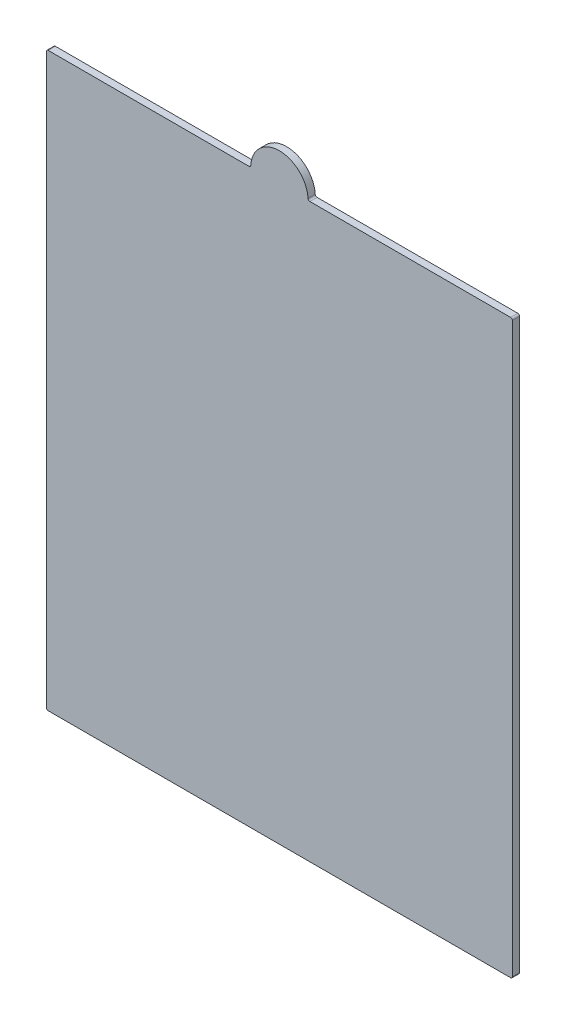
ISO-10303-21;
HEADER;
FILE_DESCRIPTION(('STEP AP214'),'2;1');
FILE_NAME('part.step','',(''),(''),'','','');
FILE_SCHEMA(('AUTOMOTIVE_DESIGN { 1 0 10303 214 1 1 1 1 }'));
ENDSEC;
DATA;
#1=APPLICATION_CONTEXT('core data for automotive mechanical design processes');
#2=APPLICATION_PROTOCOL_DEFINITION('international standard','automotive_design',2000,#1);
#3=PRODUCT_CONTEXT('',#1,'mechanical');
#4=PRODUCT('Part','Part','',(#3));
#5=PRODUCT_RELATED_PRODUCT_CATEGORY('part','',(#4));
#6=PRODUCT_DEFINITION_FORMATION('','',#4);
#7=PRODUCT_DEFINITION_CONTEXT('part definition',#1,'design');
#8=PRODUCT_DEFINITION('design','',#6,#7);
#9=PRODUCT_DEFINITION_SHAPE('','',#8);
#10=(LENGTH_UNIT() NAMED_UNIT(*) SI_UNIT(.MILLI.,.METRE.));
#11=(NAMED_UNIT(*) PLANE_ANGLE_UNIT() SI_UNIT($,.RADIAN.));
#12=(NAMED_UNIT(*) SI_UNIT($,.STERADIAN.) SOLID_ANGLE_UNIT());
#13=UNCERTAINTY_MEASURE_WITH_UNIT(LENGTH_MEASURE(1.E-05),#10,'distance_accuracy_value','');
#14=(GEOMETRIC_REPRESENTATION_CONTEXT(3) GLOBAL_UNCERTAINTY_ASSIGNED_CONTEXT((#13)) GLOBAL_UNIT_ASSIGNED_CONTEXT((#10,
#11,#12)) REPRESENTATION_CONTEXT('',''));
#15=CARTESIAN_POINT('',(0.,0.,0.));
#16=DIRECTION('',(0.,0.,1.));
#17=DIRECTION('',(1.,0.,0.));
#18=AXIS2_PLACEMENT_3D('',#15,#16,#17);
#19=CARTESIAN_POINT('',(0.,253.103,3.175));
#20=DIRECTION('',(0.,-1.,0.));
#21=DIRECTION('',(0.,0.,-1.));
#22=AXIS2_PLACEMENT_3D('',#19,#20,#21);
#23=PLANE('',#22);
#24=DIRECTION('',(-1.,0.,0.));
#25=VECTOR('',#24,1.);
#26=CARTESIAN_POINT('',(0.,253.103,0.));
#27=LINE('',#26,#25);
#28=CARTESIAN_POINT('',(89.6561158183963,253.103,0.));
#29=VERTEX_POINT('',#28);
#30=CARTESIAN_POINT('',(0.79375,253.103,0.));
#31=VERTEX_POINT('',#30);
#32=EDGE_CURVE('E156',#29,#31,#27,.T.);
#33=ORIENTED_EDGE('',*,*,#32,.T.);
#34=DIRECTION('',(0.,0.,-1.));
#35=VECTOR('',#34,1.);
#36=CARTESIAN_POINT('',(0.79375,253.103,3.175));
#37=LINE('',#36,#35);
#38=CARTESIAN_POINT('',(0.79375,253.103,3.175));
#39=VERTEX_POINT('',#38);
#40=EDGE_CURVE('E51',#31,#39,#37,.F.);
#41=ORIENTED_EDGE('',*,*,#40,.T.);
#42=DIRECTION('',(-1.,0.,0.));
#43=VECTOR('',#42,1.);
#44=CARTESIAN_POINT('',(0.,253.103,3.175));
#45=LINE('',#44,#43);
#46=CARTESIAN_POINT('',(89.6561158183963,253.103,3.175));
#47=VERTEX_POINT('',#46);
#48=EDGE_CURVE('E230',#47,#39,#45,.T.);
#49=ORIENTED_EDGE('',*,*,#48,.F.);
#50=DIRECTION('',(0.,0.,1.));
#51=VECTOR('',#50,1.);
#52=CARTESIAN_POINT('',(89.6561158183963,253.103,0.));
#53=LINE('',#52,#51);
#54=EDGE_CURVE('E193',#47,#29,#53,.F.);
#55=ORIENTED_EDGE('',*,*,#54,.T.);
#56=EDGE_LOOP('',(#33,#41,#49,#55));
#57=FACE_BOUND('',#56,.T.);
#58=ADVANCED_FACE('F36',(#57),#23,.F.);
#59=CARTESIAN_POINT('',(205.45925,253.103,3.175));
#60=VERTEX_POINT('',#59);
#61=CARTESIAN_POINT('',(116.596884181604,253.103,3.175));
#62=VERTEX_POINT('',#61);
#63=EDGE_CURVE('E166',#60,#62,#45,.T.);
#64=ORIENTED_EDGE('',*,*,#63,.F.);
#65=DIRECTION('',(0.,0.,-1.));
#66=VECTOR('',#65,1.);
#67=CARTESIAN_POINT('',(205.45925,253.103,3.175));
#68=LINE('',#67,#66);
#69=CARTESIAN_POINT('',(205.45925,253.103,0.));
#70=VERTEX_POINT('',#69);
#71=EDGE_CURVE('E190',#60,#70,#68,.T.);
#72=ORIENTED_EDGE('',*,*,#71,.T.);
#73=CARTESIAN_POINT('',(116.596884181604,253.103,0.));
#74=VERTEX_POINT('',#73);
#75=EDGE_CURVE('E162',#70,#74,#27,.T.);
#76=ORIENTED_EDGE('',*,*,#75,.T.);
#77=DIRECTION('',(0.,0.,1.));
#78=VECTOR('',#77,1.);
#79=CARTESIAN_POINT('',(116.596884181604,253.103,3.175));
#80=LINE('',#79,#78);
#81=EDGE_CURVE('E188',#74,#62,#80,.T.);
#82=ORIENTED_EDGE('',*,*,#81,.T.);
#83=EDGE_LOOP('',(#64,#72,#76,#82));
#84=FACE_BOUND('',#83,.T.);
#85=ADVANCED_FACE('F213',(#84),#23,.F.);
#86=CARTESIAN_POINT('',(0.,0.,3.175));
#87=DIRECTION('',(1.,0.,0.));
#88=DIRECTION('',(0.,0.,-1.));
#89=AXIS2_PLACEMENT_3D('',#86,#87,#88);
#90=PLANE('',#89);
#91=DIRECTION('',(0.,-1.,0.));
#92=VECTOR('',#91,1.);
#93=CARTESIAN_POINT('',(0.,0.,0.));
#94=LINE('',#93,#92);
#95=CARTESIAN_POINT('',(0.,252.30925,0.));
#96=VERTEX_POINT('',#95);
#97=CARTESIAN_POINT('',(0.,0.79375,0.));
#98=VERTEX_POINT('',#97);
#99=EDGE_CURVE('E153',#96,#98,#94,.T.);
#100=ORIENTED_EDGE('',*,*,#99,.T.);
#101=DIRECTION('',(0.,0.,-1.));
#102=VECTOR('',#101,1.);
#103=CARTESIAN_POINT('',(0.,0.79375,3.175));
#104=LINE('',#103,#102);
#105=CARTESIAN_POINT('',(0.,0.79375,3.175));
#106=VERTEX_POINT('',#105);
#107=EDGE_CURVE('E131',#98,#106,#104,.F.);
#108=ORIENTED_EDGE('',*,*,#107,.T.);
#109=DIRECTION('',(0.,-1.,0.));
#110=VECTOR('',#109,1.);
#111=CARTESIAN_POINT('',(0.,0.,3.175));
#112=LINE('',#111,#110);
#113=CARTESIAN_POINT('',(0.,252.30925,3.175));
#114=VERTEX_POINT('',#113);
#115=EDGE_CURVE('E165',#114,#106,#112,.T.);
#116=ORIENTED_EDGE('',*,*,#115,.F.);
#117=DIRECTION('',(0.,0.,-1.));
#118=VECTOR('',#117,1.);
#119=CARTESIAN_POINT('',(0.,252.30925,3.175));
#120=LINE('',#119,#118);
#121=EDGE_CURVE('E136',#114,#96,#120,.T.);
#122=ORIENTED_EDGE('',*,*,#121,.T.);
#123=EDGE_LOOP('',(#100,#108,#116,#122));
#124=FACE_BOUND('',#123,.T.);
#125=ADVANCED_FACE('F238',(#124),#90,.F.);
#126=CARTESIAN_POINT('',(0.,0.,3.175));
#127=DIRECTION('',(0.,1.,0.));
#128=DIRECTION('',(0.,0.,1.));
#129=AXIS2_PLACEMENT_3D('',#126,#127,#128);
#130=PLANE('',#129);
#131=DIRECTION('',(1.,0.,0.));
#132=VECTOR('',#131,1.);
#133=CARTESIAN_POINT('',(0.,0.,3.175));
#134=LINE('',#133,#132);
#135=CARTESIAN_POINT('',(0.79375,0.,3.175));
#136=VERTEX_POINT('',#135);
#137=CARTESIAN_POINT('',(205.45925,0.,3.175));
#138=VERTEX_POINT('',#137);
#139=EDGE_CURVE('E146',#136,#138,#134,.T.);
#140=ORIENTED_EDGE('',*,*,#139,.F.);
#141=DIRECTION('',(0.,0.,-1.));
#142=VECTOR('',#141,1.);
#143=CARTESIAN_POINT('',(0.79375,0.,3.175));
#144=LINE('',#143,#142);
#145=CARTESIAN_POINT('',(0.79375,0.,0.));
#146=VERTEX_POINT('',#145);
#147=EDGE_CURVE('E130',#136,#146,#144,.T.);
#148=ORIENTED_EDGE('',*,*,#147,.T.);
#149=DIRECTION('',(1.,0.,0.));
#150=VECTOR('',#149,1.);
#151=CARTESIAN_POINT('',(0.,0.,0.));
#152=LINE('',#151,#150);
#153=CARTESIAN_POINT('',(205.45925,0.,0.));
#154=VERTEX_POINT('',#153);
#155=EDGE_CURVE('E143',#146,#154,#152,.T.);
#156=ORIENTED_EDGE('',*,*,#155,.T.);
#157=DIRECTION('',(0.,0.,-1.));
#158=VECTOR('',#157,1.);
#159=CARTESIAN_POINT('',(205.45925,0.,3.175));
#160=LINE('',#159,#158);
#161=EDGE_CURVE('E148',#154,#138,#160,.F.);
#162=ORIENTED_EDGE('',*,*,#161,.T.);
#163=EDGE_LOOP('',(#140,#148,#156,#162));
#164=FACE_BOUND('',#163,.T.);
#165=ADVANCED_FACE('F142',(#164),#130,.F.);
#166=CARTESIAN_POINT('',(206.253,0.,3.175));
#167=DIRECTION('',(-1.,0.,0.));
#168=DIRECTION('',(0.,0.,1.));
#169=AXIS2_PLACEMENT_3D('',#166,#167,#168);
#170=PLANE('',#169);
#171=DIRECTION('',(0.,1.,0.));
#172=VECTOR('',#171,1.);
#173=CARTESIAN_POINT('',(206.253,0.,3.175));
#174=LINE('',#173,#172);
#175=CARTESIAN_POINT('',(206.253,0.79375,3.175));
#176=VERTEX_POINT('',#175);
#177=CARTESIAN_POINT('',(206.253,252.30925,3.175));
#178=VERTEX_POINT('',#177);
#179=EDGE_CURVE('E228',#176,#178,#174,.T.);
#180=ORIENTED_EDGE('',*,*,#179,.F.);
#181=DIRECTION('',(0.,0.,-1.));
#182=VECTOR('',#181,1.);
#183=CARTESIAN_POINT('',(206.253,0.79375,3.175));
#184=LINE('',#183,#182);
#185=CARTESIAN_POINT('',(206.253,0.79375,0.));
#186=VERTEX_POINT('',#185);
#187=EDGE_CURVE('E185',#176,#186,#184,.T.);
#188=ORIENTED_EDGE('',*,*,#187,.T.);
#189=DIRECTION('',(0.,1.,0.));
#190=VECTOR('',#189,1.);
#191=CARTESIAN_POINT('',(206.253,0.,0.));
#192=LINE('',#191,#190);
#193=CARTESIAN_POINT('',(206.253,252.30925,0.));
#194=VERTEX_POINT('',#193);
#195=EDGE_CURVE('E152',#186,#194,#192,.T.);
#196=ORIENTED_EDGE('',*,*,#195,.T.);
#197=DIRECTION('',(0.,0.,-1.));
#198=VECTOR('',#197,1.);
#199=CARTESIAN_POINT('',(206.253,252.30925,3.175));
#200=LINE('',#199,#198);
#201=EDGE_CURVE('E183',#194,#178,#200,.F.);
#202=ORIENTED_EDGE('',*,*,#201,.T.);
#203=EDGE_LOOP('',(#180,#188,#196,#202));
#204=FACE_BOUND('',#203,.T.);
#205=ADVANCED_FACE('F257',(#204),#170,.F.);
#206=CARTESIAN_POINT('',(0.,0.,3.175));
#207=DIRECTION('',(0.,0.,-1.));
#208=DIRECTION('',(-1.,0.,0.));
#209=AXIS2_PLACEMENT_3D('',#206,#207,#208);
#210=PLANE('',#209);
#211=ORIENTED_EDGE('',*,*,#115,.T.);
#212=CARTESIAN_POINT('',(0.79375,0.79375,3.175));
#213=DIRECTION('',(0.,0.,-1.));
#214=DIRECTION('',(-1.,0.,0.));
#215=AXIS2_PLACEMENT_3D('',#212,#213,#214);
#216=CIRCLE('',#215,0.79375);
#217=EDGE_CURVE('E181',#106,#136,#216,.F.);
#218=ORIENTED_EDGE('',*,*,#217,.T.);
#219=ORIENTED_EDGE('',*,*,#139,.T.);
#220=CARTESIAN_POINT('',(205.45925,0.79375,3.175));
#221=DIRECTION('',(0.,0.,-1.));
#222=DIRECTION('',(-1.,0.,0.));
#223=AXIS2_PLACEMENT_3D('',#220,#221,#222);
#224=CIRCLE('',#223,0.79375);
#225=EDGE_CURVE('E179',#138,#176,#224,.F.);
#226=ORIENTED_EDGE('',*,*,#225,.T.);
#227=ORIENTED_EDGE('',*,*,#179,.T.);
#228=CARTESIAN_POINT('',(205.45925,252.30925,3.175));
#229=DIRECTION('',(0.,0.,-1.));
#230=DIRECTION('',(-1.,0.,0.));
#231=AXIS2_PLACEMENT_3D('',#228,#229,#230);
#232=CIRCLE('',#231,0.79375);
#233=EDGE_CURVE('E177',#178,#60,#232,.F.);
#234=ORIENTED_EDGE('',*,*,#233,.T.);
#235=ORIENTED_EDGE('',*,*,#63,.T.);
#236=CARTESIAN_POINT('',(116.596884181604,253.89675,3.175));
#237=DIRECTION('',(0.,0.,-1.));
#238=DIRECTION('',(-1.,0.,0.));
#239=AXIS2_PLACEMENT_3D('',#236,#237,#238);
#240=CIRCLE('',#239,0.79375);
#241=CARTESIAN_POINT('',(115.804508641509,253.850058823529,3.175));
#242=VERTEX_POINT('',#241);
#243=EDGE_CURVE('E11',#62,#242,#240,.T.);
#244=ORIENTED_EDGE('',*,*,#243,.T.);
#245=CARTESIAN_POINT('',(103.1265,253.103,3.175));
#246=DIRECTION('',(0.,0.,1.));
#247=DIRECTION('',(1.,0.,0.));
#248=AXIS2_PLACEMENT_3D('',#245,#246,#247);
#249=CIRCLE('',#248,12.7);
#250=CARTESIAN_POINT('',(90.4484913584906,253.850058823529,3.175));
#251=VERTEX_POINT('',#250);
#252=EDGE_CURVE('E158',#242,#251,#249,.T.);
#253=ORIENTED_EDGE('',*,*,#252,.T.);
#254=CARTESIAN_POINT('',(89.6561158183963,253.89675,3.175));
#255=DIRECTION('',(0.,0.,-1.));
#256=DIRECTION('',(-1.,0.,0.));
#257=AXIS2_PLACEMENT_3D('',#254,#255,#256);
#258=CIRCLE('',#257,0.79375);
#259=EDGE_CURVE('E58',#251,#47,#258,.T.);
#260=ORIENTED_EDGE('',*,*,#259,.T.);
#261=ORIENTED_EDGE('',*,*,#48,.T.);
#262=CARTESIAN_POINT('',(0.79375,252.30925,3.175));
#263=DIRECTION('',(0.,0.,-1.));
#264=DIRECTION('',(-1.,0.,0.));
#265=AXIS2_PLACEMENT_3D('',#262,#263,#264);
#266=CIRCLE('',#265,0.79375);
#267=EDGE_CURVE('E175',#39,#114,#266,.F.);
#268=ORIENTED_EDGE('',*,*,#267,.T.);
#269=EDGE_LOOP('',(#211,#218,#219,#226,#227,#234,#235,#244,#253,#260,#261,#268));
#270=FACE_BOUND('',#269,.T.);
#271=ADVANCED_FACE('F219',(#270),#210,.F.);
#272=CARTESIAN_POINT('',(0.,0.,0.));
#273=DIRECTION('',(0.,0.,-1.));
#274=DIRECTION('',(-1.,0.,0.));
#275=AXIS2_PLACEMENT_3D('',#272,#273,#274);
#276=PLANE('',#275);
#277=ORIENTED_EDGE('',*,*,#155,.F.);
#278=CARTESIAN_POINT('',(0.79375,0.79375,0.));
#279=DIRECTION('',(0.,0.,-1.));
#280=DIRECTION('',(-1.,0.,0.));
#281=AXIS2_PLACEMENT_3D('',#278,#279,#280);
#282=CIRCLE('',#281,0.79375);
#283=EDGE_CURVE('E126',#146,#98,#282,.T.);
#284=ORIENTED_EDGE('',*,*,#283,.T.);
#285=ORIENTED_EDGE('',*,*,#99,.F.);
#286=CARTESIAN_POINT('',(0.79375,252.30925,0.));
#287=DIRECTION('',(0.,0.,-1.));
#288=DIRECTION('',(-1.,0.,0.));
#289=AXIS2_PLACEMENT_3D('',#286,#287,#288);
#290=CIRCLE('',#289,0.79375);
#291=EDGE_CURVE('E147',#96,#31,#290,.T.);
#292=ORIENTED_EDGE('',*,*,#291,.T.);
#293=ORIENTED_EDGE('',*,*,#32,.F.);
#294=CARTESIAN_POINT('',(89.6561158183963,253.89675,0.));
#295=DIRECTION('',(0.,0.,-1.));
#296=DIRECTION('',(-1.,0.,0.));
#297=AXIS2_PLACEMENT_3D('',#294,#295,#296);
#298=CIRCLE('',#297,0.79375);
#299=CARTESIAN_POINT('',(90.4484913584906,253.850058823529,0.));
#300=VERTEX_POINT('',#299);
#301=EDGE_CURVE('E202',#29,#300,#298,.F.);
#302=ORIENTED_EDGE('',*,*,#301,.T.);
#303=CARTESIAN_POINT('',(103.1265,253.103,0.));
#304=DIRECTION('',(0.,0.,1.));
#305=DIRECTION('',(1.,0.,0.));
#306=AXIS2_PLACEMENT_3D('',#303,#304,#305);
#307=CIRCLE('',#306,12.7);
#308=CARTESIAN_POINT('',(115.804508641509,253.850058823529,0.));
#309=VERTEX_POINT('',#308);
#310=EDGE_CURVE('E207',#309,#300,#307,.T.);
#311=ORIENTED_EDGE('',*,*,#310,.F.);
#312=CARTESIAN_POINT('',(116.596884181604,253.89675,0.));
#313=DIRECTION('',(0.,0.,-1.));
#314=DIRECTION('',(-1.,0.,0.));
#315=AXIS2_PLACEMENT_3D('',#312,#313,#314);
#316=CIRCLE('',#315,0.79375);
#317=EDGE_CURVE('E44',#309,#74,#316,.F.);
#318=ORIENTED_EDGE('',*,*,#317,.T.);
#319=ORIENTED_EDGE('',*,*,#75,.F.);
#320=CARTESIAN_POINT('',(205.45925,252.30925,0.));
#321=DIRECTION('',(0.,0.,-1.));
#322=DIRECTION('',(-1.,0.,0.));
#323=AXIS2_PLACEMENT_3D('',#320,#321,#322);
#324=CIRCLE('',#323,0.79375);
#325=EDGE_CURVE('E169',#70,#194,#324,.T.);
#326=ORIENTED_EDGE('',*,*,#325,.T.);
#327=ORIENTED_EDGE('',*,*,#195,.F.);
#328=CARTESIAN_POINT('',(205.45925,0.79375,0.));
#329=DIRECTION('',(0.,0.,-1.));
#330=DIRECTION('',(-1.,0.,0.));
#331=AXIS2_PLACEMENT_3D('',#328,#329,#330);
#332=CIRCLE('',#331,0.79375);
#333=EDGE_CURVE('E137',#186,#154,#332,.T.);
#334=ORIENTED_EDGE('',*,*,#333,.T.);
#335=EDGE_LOOP('',(#277,#284,#285,#292,#293,#302,#311,#318,#319,#326,#327,#334));
#336=FACE_BOUND('',#335,.T.);
#337=ADVANCED_FACE('F150',(#336),#276,.T.);
#338=CARTESIAN_POINT('',(103.1265,253.103,3.175));
#339=DIRECTION('',(0.,0.,-1.));
#340=DIRECTION('',(-1.,0.,0.));
#341=AXIS2_PLACEMENT_3D('',#338,#339,#340);
#342=CYLINDRICAL_SURFACE('',#341,12.7);
#343=ORIENTED_EDGE('',*,*,#310,.T.);
#344=DIRECTION('',(0.,0.,-1.));
#345=VECTOR('',#344,1.);
#346=CARTESIAN_POINT('',(90.4484913584906,253.850058823529,3.175));
#347=LINE('',#346,#345);
#348=EDGE_CURVE('E200',#300,#251,#347,.F.);
#349=ORIENTED_EDGE('',*,*,#348,.T.);
#350=ORIENTED_EDGE('',*,*,#252,.F.);
#351=DIRECTION('',(0.,0.,-1.));
#352=VECTOR('',#351,1.);
#353=CARTESIAN_POINT('',(115.804508641509,253.850058823529,3.175));
#354=LINE('',#353,#352);
#355=EDGE_CURVE('E197',#242,#309,#354,.T.);
#356=ORIENTED_EDGE('',*,*,#355,.T.);
#357=EDGE_LOOP('',(#343,#349,#350,#356));
#358=FACE_BOUND('',#357,.T.);
#359=ADVANCED_FACE('F221',(#358),#342,.T.);
#360=CARTESIAN_POINT('',(0.79375,0.79375,3.175));
#361=DIRECTION('',(0.,0.,-1.));
#362=DIRECTION('',(-1.,0.,0.));
#363=AXIS2_PLACEMENT_3D('',#360,#361,#362);
#364=CYLINDRICAL_SURFACE('',#363,0.79375);
#365=ORIENTED_EDGE('',*,*,#217,.F.);
#366=ORIENTED_EDGE('',*,*,#107,.F.);
#367=ORIENTED_EDGE('',*,*,#283,.F.);
#368=ORIENTED_EDGE('',*,*,#147,.F.);
#369=EDGE_LOOP('',(#365,#366,#367,#368));
#370=FACE_BOUND('',#369,.T.);
#371=ADVANCED_FACE('F129',(#370),#364,.T.);
#372=CARTESIAN_POINT('',(205.45925,0.79375,3.175));
#373=DIRECTION('',(0.,0.,-1.));
#374=DIRECTION('',(-1.,0.,0.));
#375=AXIS2_PLACEMENT_3D('',#372,#373,#374);
#376=CYLINDRICAL_SURFACE('',#375,0.79375);
#377=ORIENTED_EDGE('',*,*,#225,.F.);
#378=ORIENTED_EDGE('',*,*,#161,.F.);
#379=ORIENTED_EDGE('',*,*,#333,.F.);
#380=ORIENTED_EDGE('',*,*,#187,.F.);
#381=EDGE_LOOP('',(#377,#378,#379,#380));
#382=FACE_BOUND('',#381,.T.);
#383=ADVANCED_FACE('F267',(#382),#376,.T.);
#384=CARTESIAN_POINT('',(205.45925,252.30925,3.175));
#385=DIRECTION('',(0.,0.,-1.));
#386=DIRECTION('',(-1.,0.,0.));
#387=AXIS2_PLACEMENT_3D('',#384,#385,#386);
#388=CYLINDRICAL_SURFACE('',#387,0.79375);
#389=ORIENTED_EDGE('',*,*,#233,.F.);
#390=ORIENTED_EDGE('',*,*,#201,.F.);
#391=ORIENTED_EDGE('',*,*,#325,.F.);
#392=ORIENTED_EDGE('',*,*,#71,.F.);
#393=EDGE_LOOP('',(#389,#390,#391,#392));
#394=FACE_BOUND('',#393,.T.);
#395=ADVANCED_FACE('F247',(#394),#388,.T.);
#396=CARTESIAN_POINT('',(0.79375,252.30925,3.175));
#397=DIRECTION('',(0.,0.,-1.));
#398=DIRECTION('',(-1.,0.,0.));
#399=AXIS2_PLACEMENT_3D('',#396,#397,#398);
#400=CYLINDRICAL_SURFACE('',#399,0.79375);
#401=ORIENTED_EDGE('',*,*,#267,.F.);
#402=ORIENTED_EDGE('',*,*,#40,.F.);
#403=ORIENTED_EDGE('',*,*,#291,.F.);
#404=ORIENTED_EDGE('',*,*,#121,.F.);
#405=EDGE_LOOP('',(#401,#402,#403,#404));
#406=FACE_BOUND('',#405,.T.);
#407=ADVANCED_FACE('F236',(#406),#400,.T.);
#408=CARTESIAN_POINT('',(89.6561158183963,253.89675,3.175));
#409=DIRECTION('',(0.,0.,-1.));
#410=DIRECTION('',(-1.,0.,0.));
#411=AXIS2_PLACEMENT_3D('',#408,#409,#410);
#412=CYLINDRICAL_SURFACE('',#411,0.79375);
#413=ORIENTED_EDGE('',*,*,#259,.F.);
#414=ORIENTED_EDGE('',*,*,#348,.F.);
#415=ORIENTED_EDGE('',*,*,#301,.F.);
#416=ORIENTED_EDGE('',*,*,#54,.F.);
#417=EDGE_LOOP('',(#413,#414,#415,#416));
#418=FACE_BOUND('',#417,.T.);
#419=ADVANCED_FACE('F241',(#418),#412,.F.);
#420=CARTESIAN_POINT('',(116.596884181604,253.89675,3.175));
#421=DIRECTION('',(0.,0.,-1.));
#422=DIRECTION('',(-1.,0.,0.));
#423=AXIS2_PLACEMENT_3D('',#420,#421,#422);
#424=CYLINDRICAL_SURFACE('',#423,0.79375);
#425=ORIENTED_EDGE('',*,*,#243,.F.);
#426=ORIENTED_EDGE('',*,*,#81,.F.);
#427=ORIENTED_EDGE('',*,*,#317,.F.);
#428=ORIENTED_EDGE('',*,*,#355,.F.);
#429=EDGE_LOOP('',(#425,#426,#427,#428));
#430=FACE_BOUND('',#429,.T.);
#431=ADVANCED_FACE('F38',(#430),#424,.F.);
#432=CLOSED_SHELL('',(#58,#85,#125,#165,#205,#271,#337,#359,#371,#383,#395,#407,#419,#431));
#433=MANIFOLD_SOLID_BREP('B2',#432);
#434=ADVANCED_BREP_SHAPE_REPRESENTATION('',(#18,#433),#14);
#435=SHAPE_DEFINITION_REPRESENTATION(#9,#434);
ENDSEC;
END-ISO-10303-21;
